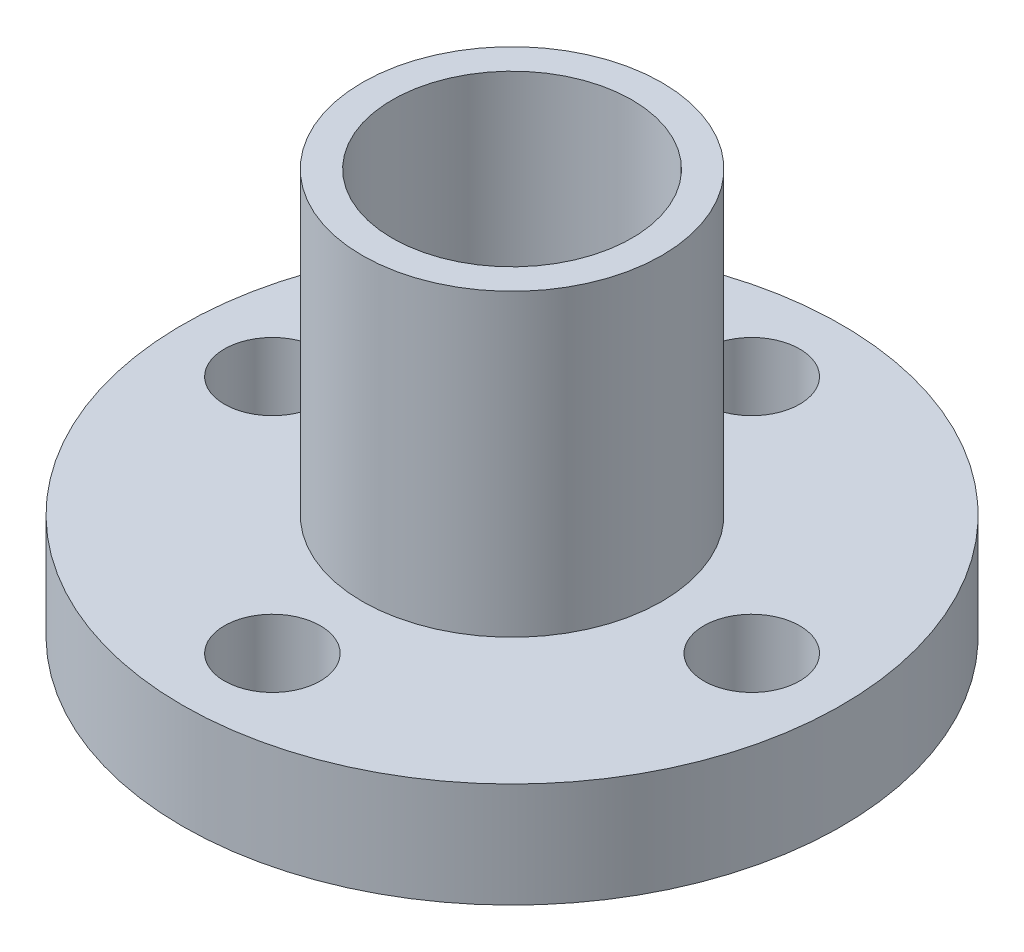
ISO-10303-21;
HEADER;
FILE_DESCRIPTION(('STEP AP214'),'2;1');
FILE_NAME('part.step','',(''),(''),'','','');
FILE_SCHEMA(('AUTOMOTIVE_DESIGN { 1 0 10303 214 1 1 1 1 }'));
ENDSEC;
DATA;
#1=APPLICATION_CONTEXT('core data for automotive mechanical design processes');
#2=APPLICATION_PROTOCOL_DEFINITION('international standard','automotive_design',2000,#1);
#3=PRODUCT_CONTEXT('',#1,'mechanical');
#4=PRODUCT('Part','Part','',(#3));
#5=PRODUCT_RELATED_PRODUCT_CATEGORY('part','',(#4));
#6=PRODUCT_DEFINITION_FORMATION('','',#4);
#7=PRODUCT_DEFINITION_CONTEXT('part definition',#1,'design');
#8=PRODUCT_DEFINITION('design','',#6,#7);
#9=PRODUCT_DEFINITION_SHAPE('','',#8);
#10=(LENGTH_UNIT() NAMED_UNIT(*) SI_UNIT(.MILLI.,.METRE.));
#11=(NAMED_UNIT(*) PLANE_ANGLE_UNIT() SI_UNIT($,.RADIAN.));
#12=(NAMED_UNIT(*) SI_UNIT($,.STERADIAN.) SOLID_ANGLE_UNIT());
#13=UNCERTAINTY_MEASURE_WITH_UNIT(LENGTH_MEASURE(1.E-05),#10,'distance_accuracy_value','');
#14=(GEOMETRIC_REPRESENTATION_CONTEXT(3) GLOBAL_UNCERTAINTY_ASSIGNED_CONTEXT((#13)) GLOBAL_UNIT_ASSIGNED_CONTEXT((#10,
#11,#12)) REPRESENTATION_CONTEXT('',''));
#15=CARTESIAN_POINT('',(0.,0.,0.));
#16=DIRECTION('',(0.,0.,1.));
#17=DIRECTION('',(1.,0.,0.));
#18=AXIS2_PLACEMENT_3D('',#15,#16,#17);
#19=CARTESIAN_POINT('',(0.,15.,0.));
#20=DIRECTION('',(0.,-1.,0.));
#21=DIRECTION('',(0.,0.,-1.));
#22=AXIS2_PLACEMENT_3D('',#19,#20,#21);
#23=CYLINDRICAL_SURFACE('',#22,5.);
#24=CARTESIAN_POINT('',(0.,0.,0.));
#25=DIRECTION('',(0.,1.,0.));
#26=DIRECTION('',(0.,0.,1.));
#27=AXIS2_PLACEMENT_3D('',#24,#25,#26);
#28=CIRCLE('',#27,5.);
#29=CARTESIAN_POINT('',(0.,0.,5.));
#30=VERTEX_POINT('',#29);
#31=EDGE_CURVE('E56',#30,#30,#28,.T.);
#32=ORIENTED_EDGE('',*,*,#31,.T.);
#33=EDGE_LOOP('',(#32));
#34=FACE_BOUND('',#33,.T.);
#35=CARTESIAN_POINT('',(0.,1.5,0.));
#36=DIRECTION('',(0.,1.,0.));
#37=DIRECTION('',(0.,0.,1.));
#38=AXIS2_PLACEMENT_3D('',#35,#36,#37);
#39=CIRCLE('',#38,5.);
#40=CARTESIAN_POINT('',(0.,1.5,5.));
#41=VERTEX_POINT('',#40);
#42=EDGE_CURVE('E10',#41,#41,#39,.T.);
#43=ORIENTED_EDGE('',*,*,#42,.F.);
#44=EDGE_LOOP('',(#43));
#45=FACE_BOUND('',#44,.T.);
#46=ADVANCED_FACE('F43',(#34,#45),#23,.T.);
#47=CARTESIAN_POINT('',(0.,15.,0.));
#48=DIRECTION('',(0.,1.,0.));
#49=DIRECTION('',(0.,0.,1.));
#50=AXIS2_PLACEMENT_3D('',#47,#48,#49);
#51=PLANE('',#50);
#52=CARTESIAN_POINT('',(0.,15.,0.));
#53=DIRECTION('',(0.,1.,0.));
#54=DIRECTION('',(0.,0.,1.));
#55=AXIS2_PLACEMENT_3D('',#52,#53,#54);
#56=CIRCLE('',#55,5.);
#57=CARTESIAN_POINT('',(0.,15.,5.));
#58=VERTEX_POINT('',#57);
#59=EDGE_CURVE('E51',#58,#58,#56,.T.);
#60=ORIENTED_EDGE('',*,*,#59,.T.);
#61=EDGE_LOOP('',(#60));
#62=FACE_BOUND('',#61,.T.);
#63=CARTESIAN_POINT('',(0.,15.,0.));
#64=DIRECTION('',(0.,1.,0.));
#65=DIRECTION('',(0.,0.,1.));
#66=AXIS2_PLACEMENT_3D('',#63,#64,#65);
#67=CIRCLE('',#66,4.);
#68=CARTESIAN_POINT('',(0.,15.,4.));
#69=VERTEX_POINT('',#68);
#70=EDGE_CURVE('E62',#69,#69,#67,.T.);
#71=ORIENTED_EDGE('',*,*,#70,.F.);
#72=EDGE_LOOP('',(#71));
#73=FACE_BOUND('',#72,.T.);
#74=ADVANCED_FACE('F139',(#62,#73),#51,.T.);
#75=CARTESIAN_POINT('',(0.,0.,0.));
#76=DIRECTION('',(0.,1.,0.));
#77=DIRECTION('',(0.,0.,1.));
#78=AXIS2_PLACEMENT_3D('',#75,#76,#77);
#79=PLANE('',#78);
#80=ORIENTED_EDGE('',*,*,#31,.F.);
#81=EDGE_LOOP('',(#80));
#82=FACE_BOUND('',#81,.T.);
#83=CARTESIAN_POINT('',(0.,0.,0.));
#84=DIRECTION('',(0.,1.,0.));
#85=DIRECTION('',(0.,0.,1.));
#86=AXIS2_PLACEMENT_3D('',#83,#84,#85);
#87=CIRCLE('',#86,4.);
#88=CARTESIAN_POINT('',(0.,0.,4.));
#89=VERTEX_POINT('',#88);
#90=EDGE_CURVE('E64',#89,#89,#87,.T.);
#91=ORIENTED_EDGE('',*,*,#90,.T.);
#92=EDGE_LOOP('',(#91));
#93=FACE_BOUND('',#92,.T.);
#94=ADVANCED_FACE('F144',(#82,#93),#79,.F.);
#95=CARTESIAN_POINT('',(0.,5.,0.));
#96=DIRECTION('',(0.,1.,0.));
#97=DIRECTION('',(0.,0.,1.));
#98=AXIS2_PLACEMENT_3D('',#95,#96,#97);
#99=CIRCLE('',#98,5.);
#100=CARTESIAN_POINT('',(0.,5.,5.));
#101=VERTEX_POINT('',#100);
#102=EDGE_CURVE('E76',#101,#101,#99,.T.);
#103=ORIENTED_EDGE('',*,*,#102,.T.);
#104=EDGE_LOOP('',(#103));
#105=FACE_BOUND('',#104,.T.);
#106=ORIENTED_EDGE('',*,*,#59,.F.);
#107=EDGE_LOOP('',(#106));
#108=FACE_BOUND('',#107,.T.);
#109=ADVANCED_FACE('F45',(#105,#108),#23,.T.);
#110=CARTESIAN_POINT('',(0.,15.,0.));
#111=DIRECTION('',(0.,-1.,0.));
#112=DIRECTION('',(0.,0.,-1.));
#113=AXIS2_PLACEMENT_3D('',#110,#111,#112);
#114=CYLINDRICAL_SURFACE('',#113,4.);
#115=ORIENTED_EDGE('',*,*,#70,.T.);
#116=EDGE_LOOP('',(#115));
#117=FACE_BOUND('',#116,.T.);
#118=ORIENTED_EDGE('',*,*,#90,.F.);
#119=EDGE_LOOP('',(#118));
#120=FACE_BOUND('',#119,.T.);
#121=ADVANCED_FACE('F122',(#117,#120),#114,.F.);
#122=CARTESIAN_POINT('',(0.,5.,0.));
#123=DIRECTION('',(0.,1.,0.));
#124=DIRECTION('',(0.,0.,1.));
#125=AXIS2_PLACEMENT_3D('',#122,#123,#124);
#126=PLANE('',#125);
#127=CARTESIAN_POINT('',(0.,5.,8.));
#128=DIRECTION('',(0.,1.,0.));
#129=DIRECTION('',(0.,0.,1.));
#130=AXIS2_PLACEMENT_3D('',#127,#128,#129);
#131=CIRCLE('',#130,1.6);
#132=CARTESIAN_POINT('',(0.,5.,9.6));
#133=VERTEX_POINT('',#132);
#134=EDGE_CURVE('E96',#133,#133,#131,.T.);
#135=ORIENTED_EDGE('',*,*,#134,.F.);
#136=EDGE_LOOP('',(#135));
#137=FACE_BOUND('',#136,.T.);
#138=CARTESIAN_POINT('',(0.,5.,-8.));
#139=DIRECTION('',(0.,1.,0.));
#140=DIRECTION('',(0.,0.,1.));
#141=AXIS2_PLACEMENT_3D('',#138,#139,#140);
#142=CIRCLE('',#141,1.6);
#143=CARTESIAN_POINT('',(0.,5.,-6.4));
#144=VERTEX_POINT('',#143);
#145=EDGE_CURVE('E83',#144,#144,#142,.T.);
#146=ORIENTED_EDGE('',*,*,#145,.F.);
#147=EDGE_LOOP('',(#146));
#148=FACE_BOUND('',#147,.T.);
#149=CARTESIAN_POINT('',(0.,5.,0.));
#150=DIRECTION('',(0.,1.,0.));
#151=DIRECTION('',(0.,0.,1.));
#152=AXIS2_PLACEMENT_3D('',#149,#150,#151);
#153=CIRCLE('',#152,11.);
#154=CARTESIAN_POINT('',(0.,5.,11.));
#155=VERTEX_POINT('',#154);
#156=EDGE_CURVE('E68',#155,#155,#153,.T.);
#157=ORIENTED_EDGE('',*,*,#156,.T.);
#158=EDGE_LOOP('',(#157));
#159=FACE_BOUND('',#158,.T.);
#160=ORIENTED_EDGE('',*,*,#102,.F.);
#161=EDGE_LOOP('',(#160));
#162=FACE_BOUND('',#161,.T.);
#163=CARTESIAN_POINT('',(8.,5.,0.));
#164=DIRECTION('',(0.,1.,0.));
#165=DIRECTION('',(0.,0.,1.));
#166=AXIS2_PLACEMENT_3D('',#163,#164,#165);
#167=CIRCLE('',#166,1.6);
#168=CARTESIAN_POINT('',(8.,5.,1.60000000000003));
#169=VERTEX_POINT('',#168);
#170=EDGE_CURVE('E88',#169,#169,#167,.T.);
#171=ORIENTED_EDGE('',*,*,#170,.F.);
#172=EDGE_LOOP('',(#171));
#173=FACE_BOUND('',#172,.T.);
#174=CARTESIAN_POINT('',(-8.,5.,0.));
#175=DIRECTION('',(0.,1.,0.));
#176=DIRECTION('',(0.,0.,1.));
#177=AXIS2_PLACEMENT_3D('',#174,#175,#176);
#178=CIRCLE('',#177,1.6);
#179=CARTESIAN_POINT('',(-8.,5.,1.59999999999992));
#180=VERTEX_POINT('',#179);
#181=EDGE_CURVE('E104',#180,#180,#178,.T.);
#182=ORIENTED_EDGE('',*,*,#181,.F.);
#183=EDGE_LOOP('',(#182));
#184=FACE_BOUND('',#183,.T.);
#185=ADVANCED_FACE('F119',(#137,#148,#159,#162,#173,#184),#126,.T.);
#186=CARTESIAN_POINT('',(0.,1.5,0.));
#187=DIRECTION('',(0.,1.,0.));
#188=DIRECTION('',(0.,0.,1.));
#189=AXIS2_PLACEMENT_3D('',#186,#187,#188);
#190=PLANE('',#189);
#191=CARTESIAN_POINT('',(0.,1.5,0.));
#192=DIRECTION('',(0.,1.,0.));
#193=DIRECTION('',(0.,0.,1.));
#194=AXIS2_PLACEMENT_3D('',#191,#192,#193);
#195=CIRCLE('',#194,11.);
#196=CARTESIAN_POINT('',(0.,1.5,11.));
#197=VERTEX_POINT('',#196);
#198=EDGE_CURVE('E72',#197,#197,#195,.T.);
#199=ORIENTED_EDGE('',*,*,#198,.F.);
#200=EDGE_LOOP('',(#199));
#201=FACE_BOUND('',#200,.T.);
#202=ORIENTED_EDGE('',*,*,#42,.T.);
#203=EDGE_LOOP('',(#202));
#204=FACE_BOUND('',#203,.T.);
#205=CARTESIAN_POINT('',(0.,1.5,-8.));
#206=DIRECTION('',(0.,1.,0.));
#207=DIRECTION('',(0.,0.,1.));
#208=AXIS2_PLACEMENT_3D('',#205,#206,#207);
#209=CIRCLE('',#208,1.6);
#210=CARTESIAN_POINT('',(0.,1.5,-6.4));
#211=VERTEX_POINT('',#210);
#212=EDGE_CURVE('E84',#211,#211,#209,.T.);
#213=ORIENTED_EDGE('',*,*,#212,.T.);
#214=EDGE_LOOP('',(#213));
#215=FACE_BOUND('',#214,.T.);
#216=CARTESIAN_POINT('',(8.,1.5,0.));
#217=DIRECTION('',(0.,1.,0.));
#218=DIRECTION('',(0.,0.,1.));
#219=AXIS2_PLACEMENT_3D('',#216,#217,#218);
#220=CIRCLE('',#219,1.6);
#221=CARTESIAN_POINT('',(8.,1.5,1.60000000000003));
#222=VERTEX_POINT('',#221);
#223=EDGE_CURVE('E92',#222,#222,#220,.T.);
#224=ORIENTED_EDGE('',*,*,#223,.T.);
#225=EDGE_LOOP('',(#224));
#226=FACE_BOUND('',#225,.T.);
#227=CARTESIAN_POINT('',(0.,1.5,8.));
#228=DIRECTION('',(0.,1.,0.));
#229=DIRECTION('',(0.,0.,1.));
#230=AXIS2_PLACEMENT_3D('',#227,#228,#229);
#231=CIRCLE('',#230,1.6);
#232=CARTESIAN_POINT('',(0.,1.5,9.6));
#233=VERTEX_POINT('',#232);
#234=EDGE_CURVE('E100',#233,#233,#231,.T.);
#235=ORIENTED_EDGE('',*,*,#234,.T.);
#236=EDGE_LOOP('',(#235));
#237=FACE_BOUND('',#236,.T.);
#238=CARTESIAN_POINT('',(-8.,1.5,0.));
#239=DIRECTION('',(0.,1.,0.));
#240=DIRECTION('',(0.,0.,1.));
#241=AXIS2_PLACEMENT_3D('',#238,#239,#240);
#242=CIRCLE('',#241,1.6);
#243=CARTESIAN_POINT('',(-8.,1.5,1.59999999999992));
#244=VERTEX_POINT('',#243);
#245=EDGE_CURVE('E108',#244,#244,#242,.T.);
#246=ORIENTED_EDGE('',*,*,#245,.T.);
#247=EDGE_LOOP('',(#246));
#248=FACE_BOUND('',#247,.T.);
#249=ADVANCED_FACE('F121',(#201,#204,#215,#226,#237,#248),#190,.F.);
#250=CARTESIAN_POINT('',(0.,5.,0.));
#251=DIRECTION('',(0.,-1.,0.));
#252=DIRECTION('',(0.,0.,-1.));
#253=AXIS2_PLACEMENT_3D('',#250,#251,#252);
#254=CYLINDRICAL_SURFACE('',#253,11.);
#255=ORIENTED_EDGE('',*,*,#156,.F.);
#256=EDGE_LOOP('',(#255));
#257=FACE_BOUND('',#256,.T.);
#258=ORIENTED_EDGE('',*,*,#198,.T.);
#259=EDGE_LOOP('',(#258));
#260=FACE_BOUND('',#259,.T.);
#261=ADVANCED_FACE('F129',(#257,#260),#254,.T.);
#262=CARTESIAN_POINT('',(0.,5.,-8.));
#263=DIRECTION('',(0.,-1.,0.));
#264=DIRECTION('',(0.,0.,-1.));
#265=AXIS2_PLACEMENT_3D('',#262,#263,#264);
#266=CYLINDRICAL_SURFACE('',#265,1.6);
#267=ORIENTED_EDGE('',*,*,#145,.T.);
#268=EDGE_LOOP('',(#267));
#269=FACE_BOUND('',#268,.T.);
#270=ORIENTED_EDGE('',*,*,#212,.F.);
#271=EDGE_LOOP('',(#270));
#272=FACE_BOUND('',#271,.T.);
#273=ADVANCED_FACE('F162',(#269,#272),#266,.F.);
#274=CARTESIAN_POINT('',(8.,5.,0.));
#275=DIRECTION('',(0.,-1.,0.));
#276=DIRECTION('',(0.,0.,-1.));
#277=AXIS2_PLACEMENT_3D('',#274,#275,#276);
#278=CYLINDRICAL_SURFACE('',#277,1.6);
#279=ORIENTED_EDGE('',*,*,#170,.T.);
#280=EDGE_LOOP('',(#279));
#281=FACE_BOUND('',#280,.T.);
#282=ORIENTED_EDGE('',*,*,#223,.F.);
#283=EDGE_LOOP('',(#282));
#284=FACE_BOUND('',#283,.T.);
#285=ADVANCED_FACE('F158',(#281,#284),#278,.F.);
#286=CARTESIAN_POINT('',(0.,5.,8.));
#287=DIRECTION('',(0.,-1.,0.));
#288=DIRECTION('',(0.,0.,-1.));
#289=AXIS2_PLACEMENT_3D('',#286,#287,#288);
#290=CYLINDRICAL_SURFACE('',#289,1.6);
#291=ORIENTED_EDGE('',*,*,#134,.T.);
#292=EDGE_LOOP('',(#291));
#293=FACE_BOUND('',#292,.T.);
#294=ORIENTED_EDGE('',*,*,#234,.F.);
#295=EDGE_LOOP('',(#294));
#296=FACE_BOUND('',#295,.T.);
#297=ADVANCED_FACE('F161',(#293,#296),#290,.F.);
#298=CARTESIAN_POINT('',(-8.,5.,0.));
#299=DIRECTION('',(0.,-1.,0.));
#300=DIRECTION('',(0.,0.,-1.));
#301=AXIS2_PLACEMENT_3D('',#298,#299,#300);
#302=CYLINDRICAL_SURFACE('',#301,1.6);
#303=ORIENTED_EDGE('',*,*,#181,.T.);
#304=EDGE_LOOP('',(#303));
#305=FACE_BOUND('',#304,.T.);
#306=ORIENTED_EDGE('',*,*,#245,.F.);
#307=EDGE_LOOP('',(#306));
#308=FACE_BOUND('',#307,.T.);
#309=ADVANCED_FACE('F116',(#305,#308),#302,.F.);
#310=CLOSED_SHELL('',(#46,#74,#94,#109,#121,#185,#249,#261,#273,#285,#297,#309));
#311=MANIFOLD_SOLID_BREP('B2',#310);
#312=ADVANCED_BREP_SHAPE_REPRESENTATION('',(#18,#311),#14);
#313=SHAPE_DEFINITION_REPRESENTATION(#9,#312);
ENDSEC;
END-ISO-10303-21;
